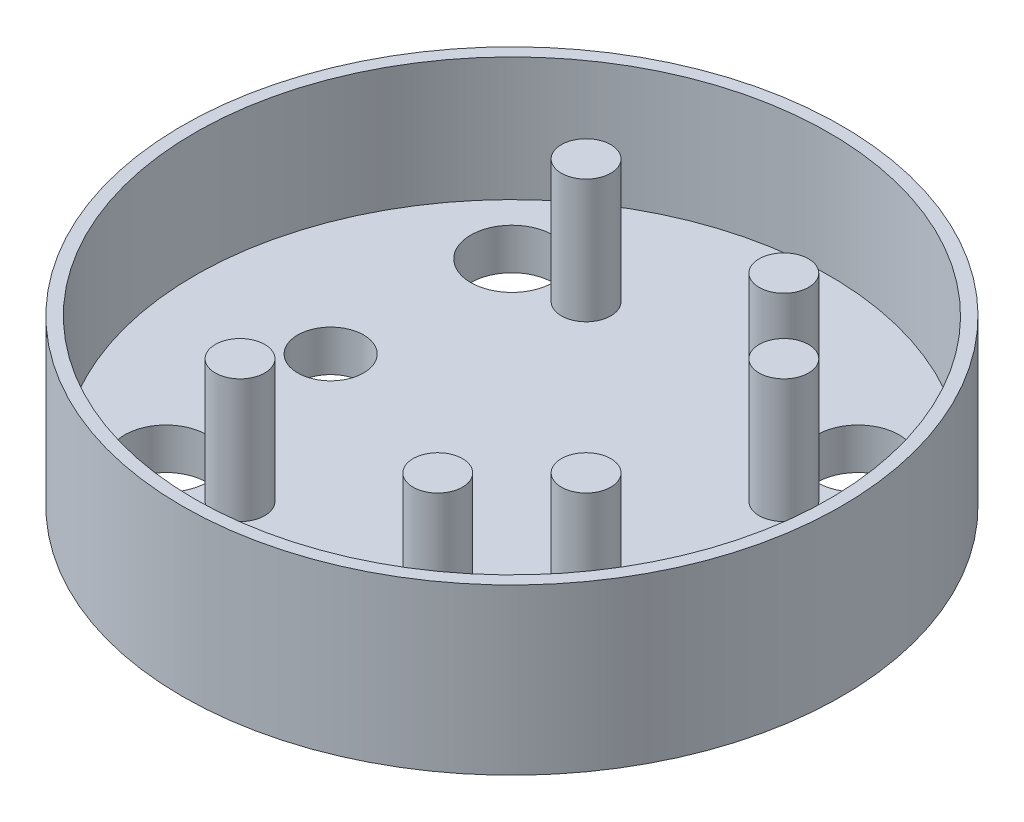
ISO-10303-21;
HEADER;
FILE_DESCRIPTION(('STEP AP214'),'2;1');
FILE_NAME('part.step','',(''),(''),'','','');
FILE_SCHEMA(('AUTOMOTIVE_DESIGN { 1 0 10303 214 1 1 1 1 }'));
ENDSEC;
DATA;
#1=APPLICATION_CONTEXT('core data for automotive mechanical design processes');
#2=APPLICATION_PROTOCOL_DEFINITION('international standard','automotive_design',2000,#1);
#3=PRODUCT_CONTEXT('',#1,'mechanical');
#4=PRODUCT('Part','Part','',(#3));
#5=PRODUCT_RELATED_PRODUCT_CATEGORY('part','',(#4));
#6=PRODUCT_DEFINITION_FORMATION('','',#4);
#7=PRODUCT_DEFINITION_CONTEXT('part definition',#1,'design');
#8=PRODUCT_DEFINITION('design','',#6,#7);
#9=PRODUCT_DEFINITION_SHAPE('','',#8);
#10=(LENGTH_UNIT() NAMED_UNIT(*) SI_UNIT(.MILLI.,.METRE.));
#11=(NAMED_UNIT(*) PLANE_ANGLE_UNIT() SI_UNIT($,.RADIAN.));
#12=(NAMED_UNIT(*) SI_UNIT($,.STERADIAN.) SOLID_ANGLE_UNIT());
#13=UNCERTAINTY_MEASURE_WITH_UNIT(LENGTH_MEASURE(1.E-05),#10,'distance_accuracy_value','');
#14=(GEOMETRIC_REPRESENTATION_CONTEXT(3) GLOBAL_UNCERTAINTY_ASSIGNED_CONTEXT((#13)) GLOBAL_UNIT_ASSIGNED_CONTEXT((#10,
#11,#12)) REPRESENTATION_CONTEXT('',''));
#15=CARTESIAN_POINT('',(0.,0.,0.));
#16=DIRECTION('',(0.,0.,1.));
#17=DIRECTION('',(1.,0.,0.));
#18=AXIS2_PLACEMENT_3D('',#15,#16,#17);
#19=CARTESIAN_POINT('',(0.,5.,0.));
#20=DIRECTION('',(0.,1.,0.));
#21=DIRECTION('',(0.,0.,1.));
#22=AXIS2_PLACEMENT_3D('',#19,#20,#21);
#23=PLANE('',#22);
#24=CARTESIAN_POINT('',(-22.,5.,0.));
#25=DIRECTION('',(0.,-1.,0.));
#26=DIRECTION('',(0.,0.,-1.));
#27=AXIS2_PLACEMENT_3D('',#24,#25,#26);
#28=CIRCLE('',#27,4.);
#29=CARTESIAN_POINT('',(-22.,5.,-4.));
#30=VERTEX_POINT('',#29);
#31=EDGE_CURVE('E153',#30,#30,#28,.T.);
#32=ORIENTED_EDGE('',*,*,#31,.T.);
#33=EDGE_LOOP('',(#32));
#34=FACE_BOUND('',#33,.T.);
#35=CARTESIAN_POINT('',(-12.,5.,-21.));
#36=DIRECTION('',(0.,1.,0.));
#37=DIRECTION('',(0.,0.,1.));
#38=AXIS2_PLACEMENT_3D('',#35,#36,#37);
#39=CIRCLE('',#38,3.);
#40=CARTESIAN_POINT('',(-12.,5.,-18.));
#41=VERTEX_POINT('',#40);
#42=EDGE_CURVE('E147',#41,#41,#39,.T.);
#43=ORIENTED_EDGE('',*,*,#42,.F.);
#44=EDGE_LOOP('',(#43));
#45=FACE_BOUND('',#44,.T.);
#46=CARTESIAN_POINT('',(12.,5.,-21.));
#47=DIRECTION('',(0.,1.,0.));
#48=DIRECTION('',(0.,0.,1.));
#49=AXIS2_PLACEMENT_3D('',#46,#47,#48);
#50=CIRCLE('',#49,3.);
#51=CARTESIAN_POINT('',(12.,5.,-18.));
#52=VERTEX_POINT('',#51);
#53=EDGE_CURVE('E145',#52,#52,#50,.T.);
#54=ORIENTED_EDGE('',*,*,#53,.F.);
#55=EDGE_LOOP('',(#54));
#56=FACE_BOUND('',#55,.T.);
#57=CARTESIAN_POINT('',(21.,5.,-12.));
#58=DIRECTION('',(0.,1.,0.));
#59=DIRECTION('',(0.,0.,1.));
#60=AXIS2_PLACEMENT_3D('',#57,#58,#59);
#61=CIRCLE('',#60,3.);
#62=CARTESIAN_POINT('',(21.,5.,-9.));
#63=VERTEX_POINT('',#62);
#64=EDGE_CURVE('E139',#63,#63,#61,.T.);
#65=ORIENTED_EDGE('',*,*,#64,.F.);
#66=EDGE_LOOP('',(#65));
#67=FACE_BOUND('',#66,.T.);
#68=CARTESIAN_POINT('',(21.,5.,12.));
#69=DIRECTION('',(0.,1.,0.));
#70=DIRECTION('',(0.,0.,1.));
#71=AXIS2_PLACEMENT_3D('',#68,#69,#70);
#72=CIRCLE('',#71,3.);
#73=CARTESIAN_POINT('',(21.,5.,15.));
#74=VERTEX_POINT('',#73);
#75=EDGE_CURVE('E135',#74,#74,#72,.T.);
#76=ORIENTED_EDGE('',*,*,#75,.F.);
#77=EDGE_LOOP('',(#76));
#78=FACE_BOUND('',#77,.T.);
#79=CARTESIAN_POINT('',(12.,5.,21.));
#80=DIRECTION('',(0.,1.,0.));
#81=DIRECTION('',(0.,0.,1.));
#82=AXIS2_PLACEMENT_3D('',#79,#80,#81);
#83=CIRCLE('',#82,3.);
#84=CARTESIAN_POINT('',(12.,5.,24.));
#85=VERTEX_POINT('',#84);
#86=EDGE_CURVE('E127',#85,#85,#83,.T.);
#87=ORIENTED_EDGE('',*,*,#86,.F.);
#88=EDGE_LOOP('',(#87));
#89=FACE_BOUND('',#88,.T.);
#90=CARTESIAN_POINT('',(-12.,5.,21.));
#91=DIRECTION('',(0.,1.,0.));
#92=DIRECTION('',(0.,0.,1.));
#93=AXIS2_PLACEMENT_3D('',#90,#91,#92);
#94=CIRCLE('',#93,3.);
#95=CARTESIAN_POINT('',(-12.,5.,24.));
#96=VERTEX_POINT('',#95);
#97=EDGE_CURVE('E119',#96,#96,#94,.T.);
#98=ORIENTED_EDGE('',*,*,#97,.F.);
#99=EDGE_LOOP('',(#98));
#100=FACE_BOUND('',#99,.T.);
#101=CARTESIAN_POINT('',(21.,5.,-21.0000000000001));
#102=DIRECTION('',(0.,1.,0.));
#103=DIRECTION('',(0.,0.,1.));
#104=AXIS2_PLACEMENT_3D('',#101,#102,#103);
#105=CIRCLE('',#104,5.);
#106=CARTESIAN_POINT('',(21.,5.,-16.0000000000001));
#107=VERTEX_POINT('',#106);
#108=EDGE_CURVE('E105',#107,#107,#105,.T.);
#109=ORIENTED_EDGE('',*,*,#108,.F.);
#110=EDGE_LOOP('',(#109));
#111=FACE_BOUND('',#110,.T.);
#112=CARTESIAN_POINT('',(-21.,5.,21.));
#113=DIRECTION('',(0.,1.,0.));
#114=DIRECTION('',(0.,0.,1.));
#115=AXIS2_PLACEMENT_3D('',#112,#113,#114);
#116=CIRCLE('',#115,5.);
#117=CARTESIAN_POINT('',(-21.,5.,26.));
#118=VERTEX_POINT('',#117);
#119=EDGE_CURVE('E93',#118,#118,#116,.T.);
#120=ORIENTED_EDGE('',*,*,#119,.F.);
#121=EDGE_LOOP('',(#120));
#122=FACE_BOUND('',#121,.T.);
#123=CARTESIAN_POINT('',(-21.,5.,-21.));
#124=DIRECTION('',(0.,1.,0.));
#125=DIRECTION('',(0.,0.,1.));
#126=AXIS2_PLACEMENT_3D('',#123,#124,#125);
#127=CIRCLE('',#126,5.);
#128=CARTESIAN_POINT('',(-21.,5.,-16.));
#129=VERTEX_POINT('',#128);
#130=EDGE_CURVE('E82',#129,#129,#127,.T.);
#131=ORIENTED_EDGE('',*,*,#130,.F.);
#132=EDGE_LOOP('',(#131));
#133=FACE_BOUND('',#132,.T.);
#134=CARTESIAN_POINT('',(21.,5.,21.));
#135=DIRECTION('',(0.,1.,0.));
#136=DIRECTION('',(0.,0.,1.));
#137=AXIS2_PLACEMENT_3D('',#134,#135,#136);
#138=CIRCLE('',#137,5.);
#139=CARTESIAN_POINT('',(21.,5.,26.));
#140=VERTEX_POINT('',#139);
#141=EDGE_CURVE('E96',#140,#140,#138,.T.);
#142=ORIENTED_EDGE('',*,*,#141,.F.);
#143=EDGE_LOOP('',(#142));
#144=FACE_BOUND('',#143,.T.);
#145=CARTESIAN_POINT('',(0.,5.,0.));
#146=DIRECTION('',(0.,1.,0.));
#147=DIRECTION('',(0.,0.,1.));
#148=AXIS2_PLACEMENT_3D('',#145,#146,#147);
#149=CIRCLE('',#148,38.5);
#150=CARTESIAN_POINT('',(0.,5.,38.5));
#151=VERTEX_POINT('',#150);
#152=EDGE_CURVE('E112',#151,#151,#149,.T.);
#153=ORIENTED_EDGE('',*,*,#152,.T.);
#154=EDGE_LOOP('',(#153));
#155=FACE_BOUND('',#154,.T.);
#156=ADVANCED_FACE('F73',(#34,#45,#56,#67,#78,#89,#100,#111,#122,#133,#144,#155),#23,.T.);
#157=CARTESIAN_POINT('',(0.,0.,0.));
#158=DIRECTION('',(0.,1.,0.));
#159=DIRECTION('',(0.,0.,1.));
#160=AXIS2_PLACEMENT_3D('',#157,#158,#159);
#161=PLANE('',#160);
#162=CARTESIAN_POINT('',(-22.,0.,0.));
#163=DIRECTION('',(0.,-1.,0.));
#164=DIRECTION('',(0.,0.,-1.));
#165=AXIS2_PLACEMENT_3D('',#162,#163,#164);
#166=CIRCLE('',#165,4.);
#167=CARTESIAN_POINT('',(-22.,0.,-4.));
#168=VERTEX_POINT('',#167);
#169=EDGE_CURVE('E156',#168,#168,#166,.T.);
#170=ORIENTED_EDGE('',*,*,#169,.F.);
#171=EDGE_LOOP('',(#170));
#172=FACE_BOUND('',#171,.T.);
#173=CARTESIAN_POINT('',(0.,0.,0.));
#174=DIRECTION('',(0.,1.,0.));
#175=DIRECTION('',(0.,0.,1.));
#176=AXIS2_PLACEMENT_3D('',#173,#174,#175);
#177=CIRCLE('',#176,40.);
#178=CARTESIAN_POINT('',(0.,0.,40.));
#179=VERTEX_POINT('',#178);
#180=EDGE_CURVE('E11',#179,#179,#177,.T.);
#181=ORIENTED_EDGE('',*,*,#180,.F.);
#182=EDGE_LOOP('',(#181));
#183=FACE_BOUND('',#182,.T.);
#184=CARTESIAN_POINT('',(-21.,0.,-21.));
#185=DIRECTION('',(0.,1.,0.));
#186=DIRECTION('',(0.,0.,1.));
#187=AXIS2_PLACEMENT_3D('',#184,#185,#186);
#188=CIRCLE('',#187,5.);
#189=CARTESIAN_POINT('',(-21.,0.,-16.));
#190=VERTEX_POINT('',#189);
#191=EDGE_CURVE('E88',#190,#190,#188,.T.);
#192=ORIENTED_EDGE('',*,*,#191,.T.);
#193=EDGE_LOOP('',(#192));
#194=FACE_BOUND('',#193,.T.);
#195=CARTESIAN_POINT('',(-21.,0.,21.));
#196=DIRECTION('',(0.,1.,0.));
#197=DIRECTION('',(0.,0.,1.));
#198=AXIS2_PLACEMENT_3D('',#195,#196,#197);
#199=CIRCLE('',#198,5.);
#200=CARTESIAN_POINT('',(-21.,0.,26.));
#201=VERTEX_POINT('',#200);
#202=EDGE_CURVE('E91',#201,#201,#199,.T.);
#203=ORIENTED_EDGE('',*,*,#202,.T.);
#204=EDGE_LOOP('',(#203));
#205=FACE_BOUND('',#204,.T.);
#206=CARTESIAN_POINT('',(21.,0.,21.));
#207=DIRECTION('',(0.,1.,0.));
#208=DIRECTION('',(0.,0.,1.));
#209=AXIS2_PLACEMENT_3D('',#206,#207,#208);
#210=CIRCLE('',#209,5.);
#211=CARTESIAN_POINT('',(21.,0.,26.));
#212=VERTEX_POINT('',#211);
#213=EDGE_CURVE('E97',#212,#212,#210,.T.);
#214=ORIENTED_EDGE('',*,*,#213,.T.);
#215=EDGE_LOOP('',(#214));
#216=FACE_BOUND('',#215,.T.);
#217=CARTESIAN_POINT('',(21.,0.,-21.0000000000001));
#218=DIRECTION('',(0.,1.,0.));
#219=DIRECTION('',(0.,0.,1.));
#220=AXIS2_PLACEMENT_3D('',#217,#218,#219);
#221=CIRCLE('',#220,5.);
#222=CARTESIAN_POINT('',(21.,0.,-16.0000000000001));
#223=VERTEX_POINT('',#222);
#224=EDGE_CURVE('E104',#223,#223,#221,.T.);
#225=ORIENTED_EDGE('',*,*,#224,.T.);
#226=EDGE_LOOP('',(#225));
#227=FACE_BOUND('',#226,.T.);
#228=ADVANCED_FACE('F171',(#172,#183,#194,#205,#216,#227),#161,.F.);
#229=CARTESIAN_POINT('',(0.,5.,0.));
#230=DIRECTION('',(0.,-1.,0.));
#231=DIRECTION('',(0.,0.,-1.));
#232=AXIS2_PLACEMENT_3D('',#229,#230,#231);
#233=CYLINDRICAL_SURFACE('',#232,40.);
#234=ORIENTED_EDGE('',*,*,#180,.T.);
#235=EDGE_LOOP('',(#234));
#236=FACE_BOUND('',#235,.T.);
#237=CARTESIAN_POINT('',(0.,20.,0.));
#238=DIRECTION('',(0.,1.,0.));
#239=DIRECTION('',(0.,0.,1.));
#240=AXIS2_PLACEMENT_3D('',#237,#238,#239);
#241=CIRCLE('',#240,40.);
#242=CARTESIAN_POINT('',(0.,20.,40.));
#243=VERTEX_POINT('',#242);
#244=EDGE_CURVE('E107',#243,#243,#241,.T.);
#245=ORIENTED_EDGE('',*,*,#244,.F.);
#246=EDGE_LOOP('',(#245));
#247=FACE_BOUND('',#246,.T.);
#248=ADVANCED_FACE('F80',(#236,#247),#233,.T.);
#249=CARTESIAN_POINT('',(-21.,5.,-21.));
#250=DIRECTION('',(0.,-1.,0.));
#251=DIRECTION('',(0.,0.,-1.));
#252=AXIS2_PLACEMENT_3D('',#249,#250,#251);
#253=CYLINDRICAL_SURFACE('',#252,5.);
#254=ORIENTED_EDGE('',*,*,#130,.T.);
#255=EDGE_LOOP('',(#254));
#256=FACE_BOUND('',#255,.T.);
#257=ORIENTED_EDGE('',*,*,#191,.F.);
#258=EDGE_LOOP('',(#257));
#259=FACE_BOUND('',#258,.T.);
#260=ADVANCED_FACE('F206',(#256,#259),#253,.F.);
#261=CARTESIAN_POINT('',(-21.,5.,21.));
#262=DIRECTION('',(0.,-1.,0.));
#263=DIRECTION('',(0.,0.,-1.));
#264=AXIS2_PLACEMENT_3D('',#261,#262,#263);
#265=CYLINDRICAL_SURFACE('',#264,5.);
#266=ORIENTED_EDGE('',*,*,#119,.T.);
#267=EDGE_LOOP('',(#266));
#268=FACE_BOUND('',#267,.T.);
#269=ORIENTED_EDGE('',*,*,#202,.F.);
#270=EDGE_LOOP('',(#269));
#271=FACE_BOUND('',#270,.T.);
#272=ADVANCED_FACE('F197',(#268,#271),#265,.F.);
#273=CARTESIAN_POINT('',(21.,5.,21.));
#274=DIRECTION('',(0.,-1.,0.));
#275=DIRECTION('',(0.,0.,-1.));
#276=AXIS2_PLACEMENT_3D('',#273,#274,#275);
#277=CYLINDRICAL_SURFACE('',#276,5.);
#278=ORIENTED_EDGE('',*,*,#141,.T.);
#279=EDGE_LOOP('',(#278));
#280=FACE_BOUND('',#279,.T.);
#281=ORIENTED_EDGE('',*,*,#213,.F.);
#282=EDGE_LOOP('',(#281));
#283=FACE_BOUND('',#282,.T.);
#284=ADVANCED_FACE('F186',(#280,#283),#277,.F.);
#285=CARTESIAN_POINT('',(21.,5.,-21.0000000000001));
#286=DIRECTION('',(0.,-1.,0.));
#287=DIRECTION('',(0.,0.,-1.));
#288=AXIS2_PLACEMENT_3D('',#285,#286,#287);
#289=CYLINDRICAL_SURFACE('',#288,5.);
#290=ORIENTED_EDGE('',*,*,#108,.T.);
#291=EDGE_LOOP('',(#290));
#292=FACE_BOUND('',#291,.T.);
#293=ORIENTED_EDGE('',*,*,#224,.F.);
#294=EDGE_LOOP('',(#293));
#295=FACE_BOUND('',#294,.T.);
#296=ADVANCED_FACE('F181',(#292,#295),#289,.F.);
#297=CARTESIAN_POINT('',(0.,20.,0.));
#298=DIRECTION('',(0.,-1.,0.));
#299=DIRECTION('',(0.,0.,-1.));
#300=AXIS2_PLACEMENT_3D('',#297,#298,#299);
#301=CYLINDRICAL_SURFACE('',#300,38.5);
#302=CARTESIAN_POINT('',(0.,20.,0.));
#303=DIRECTION('',(0.,1.,0.));
#304=DIRECTION('',(0.,0.,1.));
#305=AXIS2_PLACEMENT_3D('',#302,#303,#304);
#306=CIRCLE('',#305,38.5);
#307=CARTESIAN_POINT('',(0.,20.,38.5));
#308=VERTEX_POINT('',#307);
#309=EDGE_CURVE('E111',#308,#308,#306,.T.);
#310=ORIENTED_EDGE('',*,*,#309,.T.);
#311=EDGE_LOOP('',(#310));
#312=FACE_BOUND('',#311,.T.);
#313=ORIENTED_EDGE('',*,*,#152,.F.);
#314=EDGE_LOOP('',(#313));
#315=FACE_BOUND('',#314,.T.);
#316=ADVANCED_FACE('F183',(#312,#315),#301,.F.);
#317=CARTESIAN_POINT('',(0.,20.,0.));
#318=DIRECTION('',(0.,1.,0.));
#319=DIRECTION('',(0.,0.,1.));
#320=AXIS2_PLACEMENT_3D('',#317,#318,#319);
#321=PLANE('',#320);
#322=ORIENTED_EDGE('',*,*,#309,.F.);
#323=EDGE_LOOP('',(#322));
#324=FACE_BOUND('',#323,.T.);
#325=ORIENTED_EDGE('',*,*,#244,.T.);
#326=EDGE_LOOP('',(#325));
#327=FACE_BOUND('',#326,.T.);
#328=ADVANCED_FACE('F193',(#324,#327),#321,.T.);
#329=CARTESIAN_POINT('',(-12.,20.,21.));
#330=DIRECTION('',(0.,-1.,0.));
#331=DIRECTION('',(0.,0.,-1.));
#332=AXIS2_PLACEMENT_3D('',#329,#330,#331);
#333=CYLINDRICAL_SURFACE('',#332,3.);
#334=CARTESIAN_POINT('',(-12.,20.,21.));
#335=DIRECTION('',(0.,1.,0.));
#336=DIRECTION('',(0.,0.,1.));
#337=AXIS2_PLACEMENT_3D('',#334,#335,#336);
#338=CIRCLE('',#337,3.);
#339=CARTESIAN_POINT('',(-12.,20.,24.));
#340=VERTEX_POINT('',#339);
#341=EDGE_CURVE('E113',#340,#340,#338,.T.);
#342=ORIENTED_EDGE('',*,*,#341,.F.);
#343=EDGE_LOOP('',(#342));
#344=FACE_BOUND('',#343,.T.);
#345=ORIENTED_EDGE('',*,*,#97,.T.);
#346=EDGE_LOOP('',(#345));
#347=FACE_BOUND('',#346,.T.);
#348=ADVANCED_FACE('F263',(#344,#347),#333,.T.);
#349=CARTESIAN_POINT('',(0.,20.,0.));
#350=DIRECTION('',(0.,1.,0.));
#351=DIRECTION('',(0.,0.,1.));
#352=AXIS2_PLACEMENT_3D('',#349,#350,#351);
#353=PLANE('',#352);
#354=ORIENTED_EDGE('',*,*,#341,.T.);
#355=EDGE_LOOP('',(#354));
#356=FACE_BOUND('',#355,.T.);
#357=ADVANCED_FACE('F272',(#356),#353,.T.);
#358=CARTESIAN_POINT('',(12.,20.,21.));
#359=DIRECTION('',(0.,-1.,0.));
#360=DIRECTION('',(0.,0.,-1.));
#361=AXIS2_PLACEMENT_3D('',#358,#359,#360);
#362=CYLINDRICAL_SURFACE('',#361,3.);
#363=CARTESIAN_POINT('',(12.,20.,21.));
#364=DIRECTION('',(0.,1.,0.));
#365=DIRECTION('',(0.,0.,1.));
#366=AXIS2_PLACEMENT_3D('',#363,#364,#365);
#367=CIRCLE('',#366,3.);
#368=CARTESIAN_POINT('',(12.,20.,24.));
#369=VERTEX_POINT('',#368);
#370=EDGE_CURVE('E124',#369,#369,#367,.T.);
#371=ORIENTED_EDGE('',*,*,#370,.F.);
#372=EDGE_LOOP('',(#371));
#373=FACE_BOUND('',#372,.T.);
#374=ORIENTED_EDGE('',*,*,#86,.T.);
#375=EDGE_LOOP('',(#374));
#376=FACE_BOUND('',#375,.T.);
#377=ADVANCED_FACE('F282',(#373,#376),#362,.T.);
#378=CARTESIAN_POINT('',(0.,20.,0.));
#379=DIRECTION('',(0.,1.,0.));
#380=DIRECTION('',(0.,0.,1.));
#381=AXIS2_PLACEMENT_3D('',#378,#379,#380);
#382=PLANE('',#381);
#383=ORIENTED_EDGE('',*,*,#370,.T.);
#384=EDGE_LOOP('',(#383));
#385=FACE_BOUND('',#384,.T.);
#386=ADVANCED_FACE('F291',(#385),#382,.T.);
#387=CARTESIAN_POINT('',(21.,20.,12.));
#388=DIRECTION('',(0.,-1.,0.));
#389=DIRECTION('',(0.,0.,-1.));
#390=AXIS2_PLACEMENT_3D('',#387,#388,#389);
#391=CYLINDRICAL_SURFACE('',#390,3.);
#392=CARTESIAN_POINT('',(21.,20.,12.));
#393=DIRECTION('',(0.,1.,0.));
#394=DIRECTION('',(0.,0.,1.));
#395=AXIS2_PLACEMENT_3D('',#392,#393,#394);
#396=CIRCLE('',#395,3.);
#397=CARTESIAN_POINT('',(21.,20.,15.));
#398=VERTEX_POINT('',#397);
#399=EDGE_CURVE('E129',#398,#398,#396,.T.);
#400=ORIENTED_EDGE('',*,*,#399,.F.);
#401=EDGE_LOOP('',(#400));
#402=FACE_BOUND('',#401,.T.);
#403=ORIENTED_EDGE('',*,*,#75,.T.);
#404=EDGE_LOOP('',(#403));
#405=FACE_BOUND('',#404,.T.);
#406=ADVANCED_FACE('F304',(#402,#405),#391,.T.);
#407=CARTESIAN_POINT('',(0.,20.,0.));
#408=DIRECTION('',(0.,1.,0.));
#409=DIRECTION('',(0.,0.,1.));
#410=AXIS2_PLACEMENT_3D('',#407,#408,#409);
#411=PLANE('',#410);
#412=ORIENTED_EDGE('',*,*,#399,.T.);
#413=EDGE_LOOP('',(#412));
#414=FACE_BOUND('',#413,.T.);
#415=ADVANCED_FACE('F311',(#414),#411,.T.);
#416=CARTESIAN_POINT('',(21.,20.,-12.));
#417=DIRECTION('',(0.,-1.,0.));
#418=DIRECTION('',(0.,0.,-1.));
#419=AXIS2_PLACEMENT_3D('',#416,#417,#418);
#420=CYLINDRICAL_SURFACE('',#419,3.);
#421=CARTESIAN_POINT('',(21.,20.,-12.));
#422=DIRECTION('',(0.,1.,0.));
#423=DIRECTION('',(0.,0.,1.));
#424=AXIS2_PLACEMENT_3D('',#421,#422,#423);
#425=CIRCLE('',#424,3.);
#426=CARTESIAN_POINT('',(21.,20.,-9.));
#427=VERTEX_POINT('',#426);
#428=EDGE_CURVE('E134',#427,#427,#425,.T.);
#429=ORIENTED_EDGE('',*,*,#428,.F.);
#430=EDGE_LOOP('',(#429));
#431=FACE_BOUND('',#430,.T.);
#432=ORIENTED_EDGE('',*,*,#64,.T.);
#433=EDGE_LOOP('',(#432));
#434=FACE_BOUND('',#433,.T.);
#435=ADVANCED_FACE('F323',(#431,#434),#420,.T.);
#436=CARTESIAN_POINT('',(0.,20.,0.));
#437=DIRECTION('',(0.,1.,0.));
#438=DIRECTION('',(0.,0.,1.));
#439=AXIS2_PLACEMENT_3D('',#436,#437,#438);
#440=PLANE('',#439);
#441=ORIENTED_EDGE('',*,*,#428,.T.);
#442=EDGE_LOOP('',(#441));
#443=FACE_BOUND('',#442,.T.);
#444=ADVANCED_FACE('F334',(#443),#440,.T.);
#445=CARTESIAN_POINT('',(12.,20.,-21.));
#446=DIRECTION('',(0.,-1.,0.));
#447=DIRECTION('',(0.,0.,-1.));
#448=AXIS2_PLACEMENT_3D('',#445,#446,#447);
#449=CYLINDRICAL_SURFACE('',#448,3.);
#450=CARTESIAN_POINT('',(12.,20.,-21.));
#451=DIRECTION('',(0.,1.,0.));
#452=DIRECTION('',(0.,0.,1.));
#453=AXIS2_PLACEMENT_3D('',#450,#451,#452);
#454=CIRCLE('',#453,3.);
#455=CARTESIAN_POINT('',(12.,20.,-18.));
#456=VERTEX_POINT('',#455);
#457=EDGE_CURVE('E143',#456,#456,#454,.T.);
#458=ORIENTED_EDGE('',*,*,#457,.F.);
#459=EDGE_LOOP('',(#458));
#460=FACE_BOUND('',#459,.T.);
#461=ORIENTED_EDGE('',*,*,#53,.T.);
#462=EDGE_LOOP('',(#461));
#463=FACE_BOUND('',#462,.T.);
#464=ADVANCED_FACE('F344',(#460,#463),#449,.T.);
#465=CARTESIAN_POINT('',(0.,20.,0.));
#466=DIRECTION('',(0.,1.,0.));
#467=DIRECTION('',(0.,0.,1.));
#468=AXIS2_PLACEMENT_3D('',#465,#466,#467);
#469=PLANE('',#468);
#470=ORIENTED_EDGE('',*,*,#457,.T.);
#471=EDGE_LOOP('',(#470));
#472=FACE_BOUND('',#471,.T.);
#473=ADVANCED_FACE('F352',(#472),#469,.T.);
#474=CARTESIAN_POINT('',(-12.,20.,-21.));
#475=DIRECTION('',(0.,-1.,0.));
#476=DIRECTION('',(0.,0.,-1.));
#477=AXIS2_PLACEMENT_3D('',#474,#475,#476);
#478=CYLINDRICAL_SURFACE('',#477,3.);
#479=CARTESIAN_POINT('',(-12.,20.,-21.));
#480=DIRECTION('',(0.,1.,0.));
#481=DIRECTION('',(0.,0.,1.));
#482=AXIS2_PLACEMENT_3D('',#479,#480,#481);
#483=CIRCLE('',#482,3.);
#484=CARTESIAN_POINT('',(-12.,20.,-18.));
#485=VERTEX_POINT('',#484);
#486=EDGE_CURVE('E150',#485,#485,#483,.T.);
#487=ORIENTED_EDGE('',*,*,#486,.F.);
#488=EDGE_LOOP('',(#487));
#489=FACE_BOUND('',#488,.T.);
#490=ORIENTED_EDGE('',*,*,#42,.T.);
#491=EDGE_LOOP('',(#490));
#492=FACE_BOUND('',#491,.T.);
#493=ADVANCED_FACE('F361',(#489,#492),#478,.T.);
#494=CARTESIAN_POINT('',(0.,20.,0.));
#495=DIRECTION('',(0.,1.,0.));
#496=DIRECTION('',(0.,0.,1.));
#497=AXIS2_PLACEMENT_3D('',#494,#495,#496);
#498=PLANE('',#497);
#499=ORIENTED_EDGE('',*,*,#486,.T.);
#500=EDGE_LOOP('',(#499));
#501=FACE_BOUND('',#500,.T.);
#502=ADVANCED_FACE('F170',(#501),#498,.T.);
#503=CARTESIAN_POINT('',(-22.,5.,0.));
#504=DIRECTION('',(0.,-1.,0.));
#505=DIRECTION('',(0.,0.,-1.));
#506=AXIS2_PLACEMENT_3D('',#503,#504,#505);
#507=CYLINDRICAL_SURFACE('',#506,4.);
#508=ORIENTED_EDGE('',*,*,#31,.F.);
#509=EDGE_LOOP('',(#508));
#510=FACE_BOUND('',#509,.T.);
#511=ORIENTED_EDGE('',*,*,#169,.T.);
#512=EDGE_LOOP('',(#511));
#513=FACE_BOUND('',#512,.T.);
#514=ADVANCED_FACE('F163',(#510,#513),#507,.F.);
#515=CLOSED_SHELL('',(#156,#228,#248,#260,#272,#284,#296,#316,#328,#348,#357,#377,#386,#406,
#415,#435,#444,#464,#473,#493,#502,#514));
#516=MANIFOLD_SOLID_BREP('B2',#515);
#517=ADVANCED_BREP_SHAPE_REPRESENTATION('',(#18,#516),#14);
#518=SHAPE_DEFINITION_REPRESENTATION(#9,#517);
ENDSEC;
END-ISO-10303-21;
